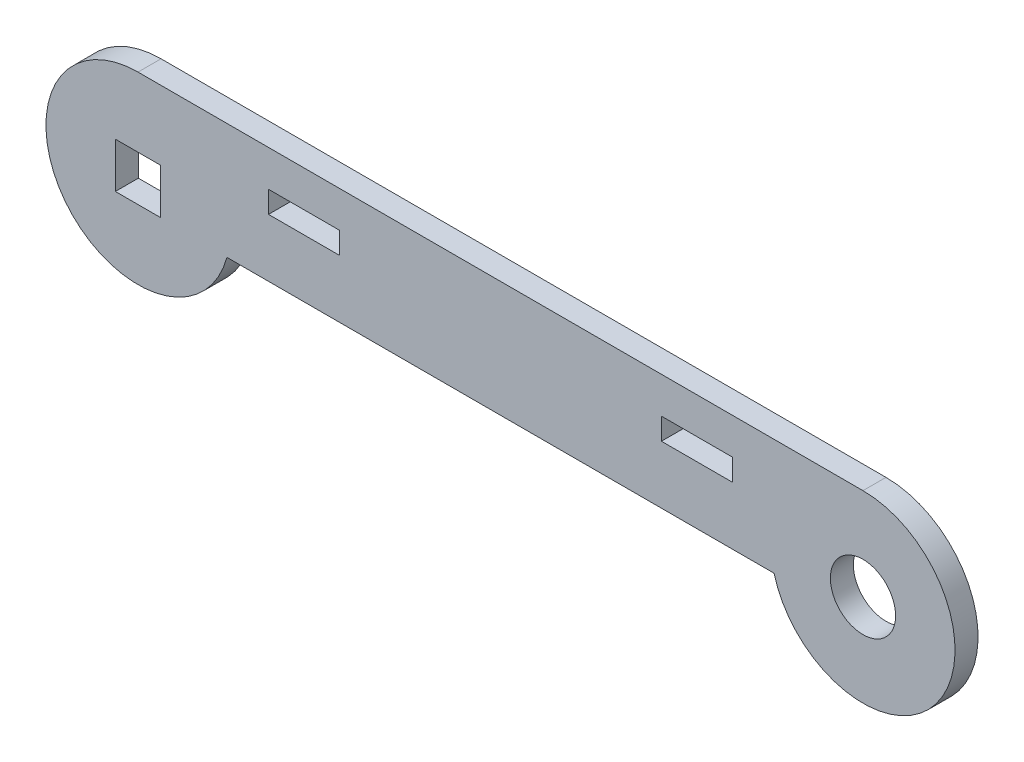
ISO-10303-21;
HEADER;
FILE_DESCRIPTION(('STEP AP214'),'2;1');
FILE_NAME('part.step','',(''),(''),'','','');
FILE_SCHEMA(('AUTOMOTIVE_DESIGN { 1 0 10303 214 1 1 1 1 }'));
ENDSEC;
DATA;
#1=APPLICATION_CONTEXT('core data for automotive mechanical design processes');
#2=APPLICATION_PROTOCOL_DEFINITION('international standard','automotive_design',2000,#1);
#3=PRODUCT_CONTEXT('',#1,'mechanical');
#4=PRODUCT('Part','Part','',(#3));
#5=PRODUCT_RELATED_PRODUCT_CATEGORY('part','',(#4));
#6=PRODUCT_DEFINITION_FORMATION('','',#4);
#7=PRODUCT_DEFINITION_CONTEXT('part definition',#1,'design');
#8=PRODUCT_DEFINITION('design','',#6,#7);
#9=PRODUCT_DEFINITION_SHAPE('','',#8);
#10=(LENGTH_UNIT() NAMED_UNIT(*) SI_UNIT(.MILLI.,.METRE.));
#11=(NAMED_UNIT(*) PLANE_ANGLE_UNIT() SI_UNIT($,.RADIAN.));
#12=(NAMED_UNIT(*) SI_UNIT($,.STERADIAN.) SOLID_ANGLE_UNIT());
#13=UNCERTAINTY_MEASURE_WITH_UNIT(LENGTH_MEASURE(1.E-05),#10,'distance_accuracy_value','');
#14=(GEOMETRIC_REPRESENTATION_CONTEXT(3) GLOBAL_UNCERTAINTY_ASSIGNED_CONTEXT((#13)) GLOBAL_UNIT_ASSIGNED_CONTEXT((#10,
#11,#12)) REPRESENTATION_CONTEXT('',''));
#15=CARTESIAN_POINT('',(0.,0.,0.));
#16=DIRECTION('',(0.,0.,1.));
#17=DIRECTION('',(1.,0.,0.));
#18=AXIS2_PLACEMENT_3D('',#15,#16,#17);
#19=CARTESIAN_POINT('',(1.5625,0.,1.5875));
#20=DIRECTION('',(-1.,0.,0.));
#21=DIRECTION('',(0.,0.,1.));
#22=AXIS2_PLACEMENT_3D('',#19,#20,#21);
#23=PLANE('',#22);
#24=DIRECTION('',(0.,1.,0.));
#25=VECTOR('',#24,1.);
#26=CARTESIAN_POINT('',(1.5625,0.,0.));
#27=LINE('',#26,#25);
#28=CARTESIAN_POINT('',(1.5625,-1.5625,0.));
#29=VERTEX_POINT('',#28);
#30=CARTESIAN_POINT('',(1.5625,1.5625,0.));
#31=VERTEX_POINT('',#30);
#32=EDGE_CURVE('E240',#29,#31,#27,.T.);
#33=ORIENTED_EDGE('',*,*,#32,.F.);
#34=DIRECTION('',(0.,0.,-1.));
#35=VECTOR('',#34,1.);
#36=CARTESIAN_POINT('',(1.5625,-1.5625,1.5875));
#37=LINE('',#36,#35);
#38=CARTESIAN_POINT('',(1.5625,-1.5625,1.5875));
#39=VERTEX_POINT('',#38);
#40=EDGE_CURVE('E12',#39,#29,#37,.T.);
#41=ORIENTED_EDGE('',*,*,#40,.F.);
#42=DIRECTION('',(0.,1.,0.));
#43=VECTOR('',#42,1.);
#44=CARTESIAN_POINT('',(1.5625,0.,1.5875));
#45=LINE('',#44,#43);
#46=CARTESIAN_POINT('',(1.5625,1.5625,1.5875));
#47=VERTEX_POINT('',#46);
#48=EDGE_CURVE('E182',#39,#47,#45,.T.);
#49=ORIENTED_EDGE('',*,*,#48,.T.);
#50=DIRECTION('',(0.,0.,-1.));
#51=VECTOR('',#50,1.);
#52=CARTESIAN_POINT('',(1.5625,1.5625,1.5875));
#53=LINE('',#52,#51);
#54=EDGE_CURVE('E117',#47,#31,#53,.T.);
#55=ORIENTED_EDGE('',*,*,#54,.T.);
#56=EDGE_LOOP('',(#33,#41,#49,#55));
#57=FACE_BOUND('',#56,.T.);
#58=ADVANCED_FACE('F39',(#57),#23,.T.);
#59=CARTESIAN_POINT('',(0.,-1.5625,1.5875));
#60=DIRECTION('',(0.,1.,0.));
#61=DIRECTION('',(0.,0.,1.));
#62=AXIS2_PLACEMENT_3D('',#59,#60,#61);
#63=PLANE('',#62);
#64=DIRECTION('',(1.,0.,0.));
#65=VECTOR('',#64,1.);
#66=CARTESIAN_POINT('',(0.,-1.5625,0.));
#67=LINE('',#66,#65);
#68=CARTESIAN_POINT('',(-1.5625,-1.5625,0.));
#69=VERTEX_POINT('',#68);
#70=EDGE_CURVE('E170',#69,#29,#67,.T.);
#71=ORIENTED_EDGE('',*,*,#70,.F.);
#72=DIRECTION('',(0.,0.,-1.));
#73=VECTOR('',#72,1.);
#74=CARTESIAN_POINT('',(-1.5625,-1.5625,1.5875));
#75=LINE('',#74,#73);
#76=CARTESIAN_POINT('',(-1.5625,-1.5625,1.5875));
#77=VERTEX_POINT('',#76);
#78=EDGE_CURVE('E49',#77,#69,#75,.T.);
#79=ORIENTED_EDGE('',*,*,#78,.F.);
#80=DIRECTION('',(1.,0.,0.));
#81=VECTOR('',#80,1.);
#82=CARTESIAN_POINT('',(0.,-1.5625,1.5875));
#83=LINE('',#82,#81);
#84=EDGE_CURVE('E168',#77,#39,#83,.T.);
#85=ORIENTED_EDGE('',*,*,#84,.T.);
#86=ORIENTED_EDGE('',*,*,#40,.T.);
#87=EDGE_LOOP('',(#71,#79,#85,#86));
#88=FACE_BOUND('',#87,.T.);
#89=ADVANCED_FACE('F166',(#88),#63,.T.);
#90=CARTESIAN_POINT('',(-1.5625,0.,1.5875));
#91=DIRECTION('',(-1.,0.,0.));
#92=DIRECTION('',(0.,0.,1.));
#93=AXIS2_PLACEMENT_3D('',#90,#91,#92);
#94=PLANE('',#93);
#95=DIRECTION('',(0.,1.,0.));
#96=VECTOR('',#95,1.);
#97=CARTESIAN_POINT('',(-1.5625,0.,0.));
#98=LINE('',#97,#96);
#99=CARTESIAN_POINT('',(-1.5625,1.5625,0.));
#100=VERTEX_POINT('',#99);
#101=EDGE_CURVE('E243',#69,#100,#98,.T.);
#102=ORIENTED_EDGE('',*,*,#101,.T.);
#103=DIRECTION('',(0.,0.,-1.));
#104=VECTOR('',#103,1.);
#105=CARTESIAN_POINT('',(-1.5625,1.5625,1.5875));
#106=LINE('',#105,#104);
#107=CARTESIAN_POINT('',(-1.5625,1.5625,1.5875));
#108=VERTEX_POINT('',#107);
#109=EDGE_CURVE('E173',#108,#100,#106,.T.);
#110=ORIENTED_EDGE('',*,*,#109,.F.);
#111=DIRECTION('',(0.,1.,0.));
#112=VECTOR('',#111,1.);
#113=CARTESIAN_POINT('',(-1.5625,0.,1.5875));
#114=LINE('',#113,#112);
#115=EDGE_CURVE('E176',#77,#108,#114,.T.);
#116=ORIENTED_EDGE('',*,*,#115,.F.);
#117=ORIENTED_EDGE('',*,*,#78,.T.);
#118=EDGE_LOOP('',(#102,#110,#116,#117));
#119=FACE_BOUND('',#118,.T.);
#120=ADVANCED_FACE('F177',(#119),#94,.F.);
#121=CARTESIAN_POINT('',(0.,3.84999999999999,1.5875));
#122=DIRECTION('',(0.,-1.,0.));
#123=DIRECTION('',(1.,0.,0.));
#124=AXIS2_PLACEMENT_3D('',#121,#122,#123);
#125=PLANE('',#124);
#126=DIRECTION('',(-1.,0.,0.));
#127=VECTOR('',#126,1.);
#128=CARTESIAN_POINT('',(0.,3.84999999999999,0.));
#129=LINE('',#128,#127);
#130=CARTESIAN_POINT('',(41.,3.85,0.));
#131=VERTEX_POINT('',#130);
#132=CARTESIAN_POINT('',(36.1,3.85,0.));
#133=VERTEX_POINT('',#132);
#134=EDGE_CURVE('E228',#131,#133,#129,.T.);
#135=ORIENTED_EDGE('',*,*,#134,.F.);
#136=DIRECTION('',(0.,0.,-1.));
#137=VECTOR('',#136,1.);
#138=CARTESIAN_POINT('',(41.,3.85,1.5875));
#139=LINE('',#138,#137);
#140=CARTESIAN_POINT('',(41.,3.85,1.5875));
#141=VERTEX_POINT('',#140);
#142=EDGE_CURVE('E251',#141,#131,#139,.T.);
#143=ORIENTED_EDGE('',*,*,#142,.F.);
#144=DIRECTION('',(-1.,0.,0.));
#145=VECTOR('',#144,1.);
#146=CARTESIAN_POINT('',(0.,3.84999999999999,1.5875));
#147=LINE('',#146,#145);
#148=CARTESIAN_POINT('',(36.1,3.85,1.5875));
#149=VERTEX_POINT('',#148);
#150=EDGE_CURVE('E337',#141,#149,#147,.T.);
#151=ORIENTED_EDGE('',*,*,#150,.T.);
#152=DIRECTION('',(0.,0.,-1.));
#153=VECTOR('',#152,1.);
#154=CARTESIAN_POINT('',(36.1,3.85,1.5875));
#155=LINE('',#154,#153);
#156=EDGE_CURVE('E253',#149,#133,#155,.T.);
#157=ORIENTED_EDGE('',*,*,#156,.T.);
#158=EDGE_LOOP('',(#135,#143,#151,#157));
#159=FACE_BOUND('',#158,.T.);
#160=ADVANCED_FACE('F362',(#159),#125,.T.);
#161=CARTESIAN_POINT('',(41.,0.,1.5875));
#162=DIRECTION('',(-1.,0.,0.));
#163=DIRECTION('',(0.,0.,1.));
#164=AXIS2_PLACEMENT_3D('',#161,#162,#163);
#165=PLANE('',#164);
#166=DIRECTION('',(0.,1.,0.));
#167=VECTOR('',#166,1.);
#168=CARTESIAN_POINT('',(41.,0.,0.));
#169=LINE('',#168,#167);
#170=CARTESIAN_POINT('',(41.,2.35,0.));
#171=VERTEX_POINT('',#170);
#172=EDGE_CURVE('E231',#171,#131,#169,.T.);
#173=ORIENTED_EDGE('',*,*,#172,.F.);
#174=DIRECTION('',(0.,0.,-1.));
#175=VECTOR('',#174,1.);
#176=CARTESIAN_POINT('',(41.,2.35,1.5875));
#177=LINE('',#176,#175);
#178=CARTESIAN_POINT('',(41.,2.35,1.5875));
#179=VERTEX_POINT('',#178);
#180=EDGE_CURVE('E259',#179,#171,#177,.T.);
#181=ORIENTED_EDGE('',*,*,#180,.F.);
#182=DIRECTION('',(0.,1.,0.));
#183=VECTOR('',#182,1.);
#184=CARTESIAN_POINT('',(41.,0.,1.5875));
#185=LINE('',#184,#183);
#186=EDGE_CURVE('E341',#179,#141,#185,.T.);
#187=ORIENTED_EDGE('',*,*,#186,.T.);
#188=ORIENTED_EDGE('',*,*,#142,.T.);
#189=EDGE_LOOP('',(#173,#181,#187,#188));
#190=FACE_BOUND('',#189,.T.);
#191=ADVANCED_FACE('F365',(#190),#165,.T.);
#192=CARTESIAN_POINT('',(0.,2.34999999999999,1.5875));
#193=DIRECTION('',(0.,-1.,0.));
#194=DIRECTION('',(1.,0.,0.));
#195=AXIS2_PLACEMENT_3D('',#192,#193,#194);
#196=PLANE('',#195);
#197=DIRECTION('',(-1.,0.,0.));
#198=VECTOR('',#197,1.);
#199=CARTESIAN_POINT('',(0.,2.34999999999999,0.));
#200=LINE('',#199,#198);
#201=CARTESIAN_POINT('',(36.1,2.35,0.));
#202=VERTEX_POINT('',#201);
#203=EDGE_CURVE('E234',#171,#202,#200,.T.);
#204=ORIENTED_EDGE('',*,*,#203,.T.);
#205=DIRECTION('',(0.,0.,-1.));
#206=VECTOR('',#205,1.);
#207=CARTESIAN_POINT('',(36.1,2.35,1.5875));
#208=LINE('',#207,#206);
#209=CARTESIAN_POINT('',(36.1,2.35,1.5875));
#210=VERTEX_POINT('',#209);
#211=EDGE_CURVE('E255',#210,#202,#208,.T.);
#212=ORIENTED_EDGE('',*,*,#211,.F.);
#213=DIRECTION('',(-1.,0.,0.));
#214=VECTOR('',#213,1.);
#215=CARTESIAN_POINT('',(0.,2.34999999999999,1.5875));
#216=LINE('',#215,#214);
#217=EDGE_CURVE('E346',#179,#210,#216,.T.);
#218=ORIENTED_EDGE('',*,*,#217,.F.);
#219=ORIENTED_EDGE('',*,*,#180,.T.);
#220=EDGE_LOOP('',(#204,#212,#218,#219));
#221=FACE_BOUND('',#220,.T.);
#222=ADVANCED_FACE('F368',(#221),#196,.F.);
#223=CARTESIAN_POINT('',(13.9,0.,1.5875));
#224=DIRECTION('',(-1.,0.,0.));
#225=DIRECTION('',(0.,0.,1.));
#226=AXIS2_PLACEMENT_3D('',#223,#224,#225);
#227=PLANE('',#226);
#228=DIRECTION('',(0.,1.,0.));
#229=VECTOR('',#228,1.);
#230=CARTESIAN_POINT('',(13.9,0.,0.));
#231=LINE('',#230,#229);
#232=CARTESIAN_POINT('',(13.9,2.35,0.));
#233=VERTEX_POINT('',#232);
#234=CARTESIAN_POINT('',(13.9,3.85,0.));
#235=VERTEX_POINT('',#234);
#236=EDGE_CURVE('E216',#233,#235,#231,.T.);
#237=ORIENTED_EDGE('',*,*,#236,.F.);
#238=DIRECTION('',(0.,0.,-1.));
#239=VECTOR('',#238,1.);
#240=CARTESIAN_POINT('',(13.9,2.35,1.5875));
#241=LINE('',#240,#239);
#242=CARTESIAN_POINT('',(13.9,2.35,1.5875));
#243=VERTEX_POINT('',#242);
#244=EDGE_CURVE('E256',#243,#233,#241,.T.);
#245=ORIENTED_EDGE('',*,*,#244,.F.);
#246=DIRECTION('',(0.,1.,0.));
#247=VECTOR('',#246,1.);
#248=CARTESIAN_POINT('',(13.9,0.,1.5875));
#249=LINE('',#248,#247);
#250=CARTESIAN_POINT('',(13.9,3.85,1.5875));
#251=VERTEX_POINT('',#250);
#252=EDGE_CURVE('E296',#243,#251,#249,.T.);
#253=ORIENTED_EDGE('',*,*,#252,.T.);
#254=DIRECTION('',(0.,0.,-1.));
#255=VECTOR('',#254,1.);
#256=CARTESIAN_POINT('',(13.9,3.85,1.5875));
#257=LINE('',#256,#255);
#258=EDGE_CURVE('E262',#251,#235,#257,.T.);
#259=ORIENTED_EDGE('',*,*,#258,.T.);
#260=EDGE_LOOP('',(#237,#245,#253,#259));
#261=FACE_BOUND('',#260,.T.);
#262=ADVANCED_FACE('F400',(#261),#227,.T.);
#263=CARTESIAN_POINT('',(0.,2.35,1.5875));
#264=DIRECTION('',(0.,1.,0.));
#265=DIRECTION('',(0.,0.,1.));
#266=AXIS2_PLACEMENT_3D('',#263,#264,#265);
#267=PLANE('',#266);
#268=DIRECTION('',(1.,0.,0.));
#269=VECTOR('',#268,1.);
#270=CARTESIAN_POINT('',(0.,2.35,0.));
#271=LINE('',#270,#269);
#272=CARTESIAN_POINT('',(9.,2.35,0.));
#273=VERTEX_POINT('',#272);
#274=EDGE_CURVE('E219',#273,#233,#271,.T.);
#275=ORIENTED_EDGE('',*,*,#274,.F.);
#276=DIRECTION('',(0.,0.,-1.));
#277=VECTOR('',#276,1.);
#278=CARTESIAN_POINT('',(9.,2.35,1.5875));
#279=LINE('',#278,#277);
#280=CARTESIAN_POINT('',(9.,2.35,1.5875));
#281=VERTEX_POINT('',#280);
#282=EDGE_CURVE('E267',#281,#273,#279,.T.);
#283=ORIENTED_EDGE('',*,*,#282,.F.);
#284=DIRECTION('',(1.,0.,0.));
#285=VECTOR('',#284,1.);
#286=CARTESIAN_POINT('',(0.,2.35,1.5875));
#287=LINE('',#286,#285);
#288=EDGE_CURVE('E319',#281,#243,#287,.T.);
#289=ORIENTED_EDGE('',*,*,#288,.T.);
#290=ORIENTED_EDGE('',*,*,#244,.T.);
#291=EDGE_LOOP('',(#275,#283,#289,#290));
#292=FACE_BOUND('',#291,.T.);
#293=ADVANCED_FACE('F411',(#292),#267,.T.);
#294=CARTESIAN_POINT('',(9.,0.,1.5875));
#295=DIRECTION('',(-1.,0.,0.));
#296=DIRECTION('',(0.,0.,1.));
#297=AXIS2_PLACEMENT_3D('',#294,#295,#296);
#298=PLANE('',#297);
#299=DIRECTION('',(0.,1.,0.));
#300=VECTOR('',#299,1.);
#301=CARTESIAN_POINT('',(9.,0.,0.));
#302=LINE('',#301,#300);
#303=CARTESIAN_POINT('',(9.,3.85,0.));
#304=VERTEX_POINT('',#303);
#305=EDGE_CURVE('E222',#273,#304,#302,.T.);
#306=ORIENTED_EDGE('',*,*,#305,.T.);
#307=DIRECTION('',(0.,0.,-1.));
#308=VECTOR('',#307,1.);
#309=CARTESIAN_POINT('',(9.,3.85,1.5875));
#310=LINE('',#309,#308);
#311=CARTESIAN_POINT('',(9.,3.85,1.5875));
#312=VERTEX_POINT('',#311);
#313=EDGE_CURVE('E264',#312,#304,#310,.T.);
#314=ORIENTED_EDGE('',*,*,#313,.F.);
#315=DIRECTION('',(0.,1.,0.));
#316=VECTOR('',#315,1.);
#317=CARTESIAN_POINT('',(9.,0.,1.5875));
#318=LINE('',#317,#316);
#319=EDGE_CURVE('E324',#281,#312,#318,.T.);
#320=ORIENTED_EDGE('',*,*,#319,.F.);
#321=ORIENTED_EDGE('',*,*,#282,.T.);
#322=EDGE_LOOP('',(#306,#314,#320,#321));
#323=FACE_BOUND('',#322,.T.);
#324=ADVANCED_FACE('F408',(#323),#298,.F.);
#325=CARTESIAN_POINT('',(0.,-1.65,1.5875));
#326=DIRECTION('',(0.,1.,0.));
#327=DIRECTION('',(-1.,0.,0.));
#328=AXIS2_PLACEMENT_3D('',#325,#326,#327);
#329=PLANE('',#328);
#330=DIRECTION('',(1.,0.,0.));
#331=VECTOR('',#330,1.);
#332=CARTESIAN_POINT('',(0.,-1.65,0.));
#333=LINE('',#332,#331);
#334=CARTESIAN_POINT('',(6.13188388670236,-1.65,0.));
#335=VERTEX_POINT('',#334);
#336=CARTESIAN_POINT('',(43.8681161132976,-1.65,0.));
#337=VERTEX_POINT('',#336);
#338=EDGE_CURVE('E205',#335,#337,#333,.T.);
#339=ORIENTED_EDGE('',*,*,#338,.T.);
#340=DIRECTION('',(0.,0.,-1.));
#341=VECTOR('',#340,1.);
#342=CARTESIAN_POINT('',(43.8681161132976,-1.65,1.5875));
#343=LINE('',#342,#341);
#344=CARTESIAN_POINT('',(43.8681161132976,-1.65,1.5875));
#345=VERTEX_POINT('',#344);
#346=EDGE_CURVE('E43',#345,#337,#343,.T.);
#347=ORIENTED_EDGE('',*,*,#346,.F.);
#348=DIRECTION('',(1.,0.,0.));
#349=VECTOR('',#348,1.);
#350=CARTESIAN_POINT('',(0.,-1.65,1.5875));
#351=LINE('',#350,#349);
#352=CARTESIAN_POINT('',(6.13188388670236,-1.65,1.5875));
#353=VERTEX_POINT('',#352);
#354=EDGE_CURVE('E249',#353,#345,#351,.T.);
#355=ORIENTED_EDGE('',*,*,#354,.F.);
#356=DIRECTION('',(0.,0.,-1.));
#357=VECTOR('',#356,1.);
#358=CARTESIAN_POINT('',(6.13188388670236,-1.65,1.5875));
#359=LINE('',#358,#357);
#360=EDGE_CURVE('E204',#353,#335,#359,.T.);
#361=ORIENTED_EDGE('',*,*,#360,.T.);
#362=EDGE_LOOP('',(#339,#347,#355,#361));
#363=FACE_BOUND('',#362,.T.);
#364=ADVANCED_FACE('F41',(#363),#329,.F.);
#365=CARTESIAN_POINT('',(50.,0.,1.5875));
#366=DIRECTION('',(0.,0.,-1.));
#367=DIRECTION('',(-1.,0.,0.));
#368=AXIS2_PLACEMENT_3D('',#365,#366,#367);
#369=CYLINDRICAL_SURFACE('',#368,6.35);
#370=CARTESIAN_POINT('',(50.,0.,0.));
#371=DIRECTION('',(0.,0.,1.));
#372=DIRECTION('',(1.,0.,0.));
#373=AXIS2_PLACEMENT_3D('',#370,#371,#372);
#374=CIRCLE('',#373,6.35);
#375=CARTESIAN_POINT('',(50.,6.35,0.));
#376=VERTEX_POINT('',#375);
#377=EDGE_CURVE('E208',#337,#376,#374,.T.);
#378=ORIENTED_EDGE('',*,*,#377,.T.);
#379=DIRECTION('',(0.,0.,-1.));
#380=VECTOR('',#379,1.);
#381=CARTESIAN_POINT('',(50.,6.35,1.5875));
#382=LINE('',#381,#380);
#383=CARTESIAN_POINT('',(50.,6.35,1.5875));
#384=VERTEX_POINT('',#383);
#385=EDGE_CURVE('E273',#384,#376,#382,.T.);
#386=ORIENTED_EDGE('',*,*,#385,.F.);
#387=CARTESIAN_POINT('',(50.,0.,1.5875));
#388=DIRECTION('',(0.,0.,1.));
#389=DIRECTION('',(1.,0.,0.));
#390=AXIS2_PLACEMENT_3D('',#387,#388,#389);
#391=CIRCLE('',#390,6.35);
#392=EDGE_CURVE('E125',#345,#384,#391,.T.);
#393=ORIENTED_EDGE('',*,*,#392,.F.);
#394=ORIENTED_EDGE('',*,*,#346,.T.);
#395=EDGE_LOOP('',(#378,#386,#393,#394));
#396=FACE_BOUND('',#395,.T.);
#397=ADVANCED_FACE('F278',(#396),#369,.T.);
#398=CARTESIAN_POINT('',(0.,6.35,1.5875));
#399=DIRECTION('',(0.,1.,0.));
#400=DIRECTION('',(-1.,0.,0.));
#401=AXIS2_PLACEMENT_3D('',#398,#399,#400);
#402=PLANE('',#401);
#403=DIRECTION('',(1.,0.,0.));
#404=VECTOR('',#403,1.);
#405=CARTESIAN_POINT('',(0.,6.35,0.));
#406=LINE('',#405,#404);
#407=CARTESIAN_POINT('',(0.,6.35,0.));
#408=VERTEX_POINT('',#407);
#409=EDGE_CURVE('E211',#408,#376,#406,.T.);
#410=ORIENTED_EDGE('',*,*,#409,.F.);
#411=DIRECTION('',(0.,0.,-1.));
#412=VECTOR('',#411,1.);
#413=CARTESIAN_POINT('',(0.,6.35,1.5875));
#414=LINE('',#413,#412);
#415=CARTESIAN_POINT('',(0.,6.35,1.5875));
#416=VERTEX_POINT('',#415);
#417=EDGE_CURVE('E272',#416,#408,#414,.T.);
#418=ORIENTED_EDGE('',*,*,#417,.F.);
#419=DIRECTION('',(1.,0.,0.));
#420=VECTOR('',#419,1.);
#421=CARTESIAN_POINT('',(0.,6.35,1.5875));
#422=LINE('',#421,#420);
#423=EDGE_CURVE('E290',#416,#384,#422,.T.);
#424=ORIENTED_EDGE('',*,*,#423,.T.);
#425=ORIENTED_EDGE('',*,*,#385,.T.);
#426=EDGE_LOOP('',(#410,#418,#424,#425));
#427=FACE_BOUND('',#426,.T.);
#428=ADVANCED_FACE('F287',(#427),#402,.T.);
#429=CARTESIAN_POINT('',(0.,1.5625,1.5875));
#430=DIRECTION('',(0.,1.,0.));
#431=DIRECTION('',(0.,0.,1.));
#432=AXIS2_PLACEMENT_3D('',#429,#430,#431);
#433=PLANE('',#432);
#434=DIRECTION('',(1.,0.,0.));
#435=VECTOR('',#434,1.);
#436=CARTESIAN_POINT('',(0.,1.5625,0.));
#437=LINE('',#436,#435);
#438=EDGE_CURVE('E110',#100,#31,#437,.T.);
#439=ORIENTED_EDGE('',*,*,#438,.T.);
#440=ORIENTED_EDGE('',*,*,#54,.F.);
#441=DIRECTION('',(1.,0.,0.));
#442=VECTOR('',#441,1.);
#443=CARTESIAN_POINT('',(0.,1.5625,1.5875));
#444=LINE('',#443,#442);
#445=EDGE_CURVE('E58',#108,#47,#444,.T.);
#446=ORIENTED_EDGE('',*,*,#445,.F.);
#447=ORIENTED_EDGE('',*,*,#109,.T.);
#448=EDGE_LOOP('',(#439,#440,#446,#447));
#449=FACE_BOUND('',#448,.T.);
#450=ADVANCED_FACE('F397',(#449),#433,.F.);
#451=CARTESIAN_POINT('',(36.1,0.,1.5875));
#452=DIRECTION('',(-1.,0.,0.));
#453=DIRECTION('',(0.,0.,1.));
#454=AXIS2_PLACEMENT_3D('',#451,#452,#453);
#455=PLANE('',#454);
#456=DIRECTION('',(0.,1.,0.));
#457=VECTOR('',#456,1.);
#458=CARTESIAN_POINT('',(36.1,0.,0.));
#459=LINE('',#458,#457);
#460=EDGE_CURVE('E237',#202,#133,#459,.T.);
#461=ORIENTED_EDGE('',*,*,#460,.T.);
#462=ORIENTED_EDGE('',*,*,#156,.F.);
#463=DIRECTION('',(0.,1.,0.));
#464=VECTOR('',#463,1.);
#465=CARTESIAN_POINT('',(36.1,0.,1.5875));
#466=LINE('',#465,#464);
#467=EDGE_CURVE('E186',#210,#149,#466,.T.);
#468=ORIENTED_EDGE('',*,*,#467,.F.);
#469=ORIENTED_EDGE('',*,*,#211,.T.);
#470=EDGE_LOOP('',(#461,#462,#468,#469));
#471=FACE_BOUND('',#470,.T.);
#472=ADVANCED_FACE('F359',(#471),#455,.F.);
#473=CARTESIAN_POINT('',(0.,3.85,1.5875));
#474=DIRECTION('',(0.,1.,0.));
#475=DIRECTION('',(0.,0.,1.));
#476=AXIS2_PLACEMENT_3D('',#473,#474,#475);
#477=PLANE('',#476);
#478=DIRECTION('',(1.,0.,0.));
#479=VECTOR('',#478,1.);
#480=CARTESIAN_POINT('',(0.,3.85,0.));
#481=LINE('',#480,#479);
#482=EDGE_CURVE('E225',#304,#235,#481,.T.);
#483=ORIENTED_EDGE('',*,*,#482,.T.);
#484=ORIENTED_EDGE('',*,*,#258,.F.);
#485=DIRECTION('',(1.,0.,0.));
#486=VECTOR('',#485,1.);
#487=CARTESIAN_POINT('',(0.,3.85,1.5875));
#488=LINE('',#487,#486);
#489=EDGE_CURVE('E329',#312,#251,#488,.T.);
#490=ORIENTED_EDGE('',*,*,#489,.F.);
#491=ORIENTED_EDGE('',*,*,#313,.T.);
#492=EDGE_LOOP('',(#483,#484,#490,#491));
#493=FACE_BOUND('',#492,.T.);
#494=ADVANCED_FACE('F384',(#493),#477,.F.);
#495=CARTESIAN_POINT('',(0.,0.,1.5875));
#496=DIRECTION('',(0.,0.,-1.));
#497=DIRECTION('',(-1.,0.,0.));
#498=AXIS2_PLACEMENT_3D('',#495,#496,#497);
#499=CYLINDRICAL_SURFACE('',#498,6.35);
#500=CARTESIAN_POINT('',(0.,0.,0.));
#501=DIRECTION('',(0.,0.,1.));
#502=DIRECTION('',(1.,0.,0.));
#503=AXIS2_PLACEMENT_3D('',#500,#501,#502);
#504=CIRCLE('',#503,6.35);
#505=EDGE_CURVE('E214',#408,#335,#504,.T.);
#506=ORIENTED_EDGE('',*,*,#505,.T.);
#507=ORIENTED_EDGE('',*,*,#360,.F.);
#508=CARTESIAN_POINT('',(0.,0.,1.5875));
#509=DIRECTION('',(0.,0.,1.));
#510=DIRECTION('',(1.,0.,0.));
#511=AXIS2_PLACEMENT_3D('',#508,#509,#510);
#512=CIRCLE('',#511,6.35);
#513=EDGE_CURVE('E292',#416,#353,#512,.T.);
#514=ORIENTED_EDGE('',*,*,#513,.F.);
#515=ORIENTED_EDGE('',*,*,#417,.T.);
#516=EDGE_LOOP('',(#506,#507,#514,#515));
#517=FACE_BOUND('',#516,.T.);
#518=ADVANCED_FACE('F293',(#517),#499,.T.);
#519=CARTESIAN_POINT('',(50.,0.,1.5875));
#520=DIRECTION('',(0.,0.,-1.));
#521=DIRECTION('',(-1.,0.,0.));
#522=AXIS2_PLACEMENT_3D('',#519,#520,#521);
#523=CYLINDRICAL_SURFACE('',#522,2.25);
#524=CARTESIAN_POINT('',(50.,0.,1.5875));
#525=DIRECTION('',(0.,0.,1.));
#526=DIRECTION('',(1.,0.,0.));
#527=AXIS2_PLACEMENT_3D('',#524,#525,#526);
#528=CIRCLE('',#527,2.25);
#529=CARTESIAN_POINT('',(52.25,0.,1.5875));
#530=VERTEX_POINT('',#529);
#531=EDGE_CURVE('E199',#530,#530,#528,.T.);
#532=ORIENTED_EDGE('',*,*,#531,.T.);
#533=EDGE_LOOP('',(#532));
#534=FACE_BOUND('',#533,.T.);
#535=CARTESIAN_POINT('',(50.,0.,0.));
#536=DIRECTION('',(0.,0.,1.));
#537=DIRECTION('',(1.,0.,0.));
#538=AXIS2_PLACEMENT_3D('',#535,#536,#537);
#539=CIRCLE('',#538,2.25);
#540=CARTESIAN_POINT('',(52.25,0.,0.));
#541=VERTEX_POINT('',#540);
#542=EDGE_CURVE('E246',#541,#541,#539,.T.);
#543=ORIENTED_EDGE('',*,*,#542,.F.);
#544=EDGE_LOOP('',(#543));
#545=FACE_BOUND('',#544,.T.);
#546=ADVANCED_FACE('F375',(#534,#545),#523,.F.);
#547=CARTESIAN_POINT('',(0.,0.,1.5875));
#548=DIRECTION('',(0.,0.,1.));
#549=DIRECTION('',(1.,0.,0.));
#550=AXIS2_PLACEMENT_3D('',#547,#548,#549);
#551=PLANE('',#550);
#552=ORIENTED_EDGE('',*,*,#354,.T.);
#553=ORIENTED_EDGE('',*,*,#392,.T.);
#554=ORIENTED_EDGE('',*,*,#423,.F.);
#555=ORIENTED_EDGE('',*,*,#513,.T.);
#556=EDGE_LOOP('',(#552,#553,#554,#555));
#557=FACE_BOUND('',#556,.T.);
#558=ORIENTED_EDGE('',*,*,#252,.F.);
#559=ORIENTED_EDGE('',*,*,#288,.F.);
#560=ORIENTED_EDGE('',*,*,#319,.T.);
#561=ORIENTED_EDGE('',*,*,#489,.T.);
#562=EDGE_LOOP('',(#558,#559,#560,#561));
#563=FACE_BOUND('',#562,.T.);
#564=ORIENTED_EDGE('',*,*,#150,.F.);
#565=ORIENTED_EDGE('',*,*,#186,.F.);
#566=ORIENTED_EDGE('',*,*,#217,.T.);
#567=ORIENTED_EDGE('',*,*,#467,.T.);
#568=EDGE_LOOP('',(#564,#565,#566,#567));
#569=FACE_BOUND('',#568,.T.);
#570=ORIENTED_EDGE('',*,*,#48,.F.);
#571=ORIENTED_EDGE('',*,*,#84,.F.);
#572=ORIENTED_EDGE('',*,*,#115,.T.);
#573=ORIENTED_EDGE('',*,*,#445,.T.);
#574=EDGE_LOOP('',(#570,#571,#572,#573));
#575=FACE_BOUND('',#574,.T.);
#576=ORIENTED_EDGE('',*,*,#531,.F.);
#577=EDGE_LOOP('',(#576));
#578=FACE_BOUND('',#577,.T.);
#579=ADVANCED_FACE('F180',(#557,#563,#569,#575,#578),#551,.T.);
#580=CARTESIAN_POINT('',(0.,0.,0.));
#581=DIRECTION('',(0.,0.,1.));
#582=DIRECTION('',(1.,0.,0.));
#583=AXIS2_PLACEMENT_3D('',#580,#581,#582);
#584=PLANE('',#583);
#585=ORIENTED_EDGE('',*,*,#338,.F.);
#586=ORIENTED_EDGE('',*,*,#505,.F.);
#587=ORIENTED_EDGE('',*,*,#409,.T.);
#588=ORIENTED_EDGE('',*,*,#377,.F.);
#589=EDGE_LOOP('',(#585,#586,#587,#588));
#590=FACE_BOUND('',#589,.T.);
#591=ORIENTED_EDGE('',*,*,#236,.T.);
#592=ORIENTED_EDGE('',*,*,#482,.F.);
#593=ORIENTED_EDGE('',*,*,#305,.F.);
#594=ORIENTED_EDGE('',*,*,#274,.T.);
#595=EDGE_LOOP('',(#591,#592,#593,#594));
#596=FACE_BOUND('',#595,.T.);
#597=ORIENTED_EDGE('',*,*,#134,.T.);
#598=ORIENTED_EDGE('',*,*,#460,.F.);
#599=ORIENTED_EDGE('',*,*,#203,.F.);
#600=ORIENTED_EDGE('',*,*,#172,.T.);
#601=EDGE_LOOP('',(#597,#598,#599,#600));
#602=FACE_BOUND('',#601,.T.);
#603=ORIENTED_EDGE('',*,*,#32,.T.);
#604=ORIENTED_EDGE('',*,*,#438,.F.);
#605=ORIENTED_EDGE('',*,*,#101,.F.);
#606=ORIENTED_EDGE('',*,*,#70,.T.);
#607=EDGE_LOOP('',(#603,#604,#605,#606));
#608=FACE_BOUND('',#607,.T.);
#609=ORIENTED_EDGE('',*,*,#542,.T.);
#610=EDGE_LOOP('',(#609));
#611=FACE_BOUND('',#610,.T.);
#612=ADVANCED_FACE('F285',(#590,#596,#602,#608,#611),#584,.F.);
#613=CLOSED_SHELL('',(#58,#89,#120,#160,#191,#222,#262,#293,#324,#364,#397,#428,#450,#472,#494,
#518,#546,#579,#612));
#614=MANIFOLD_SOLID_BREP('B2',#613);
#615=ADVANCED_BREP_SHAPE_REPRESENTATION('',(#18,#614),#14);
#616=SHAPE_DEFINITION_REPRESENTATION(#9,#615);
ENDSEC;
END-ISO-10303-21;
